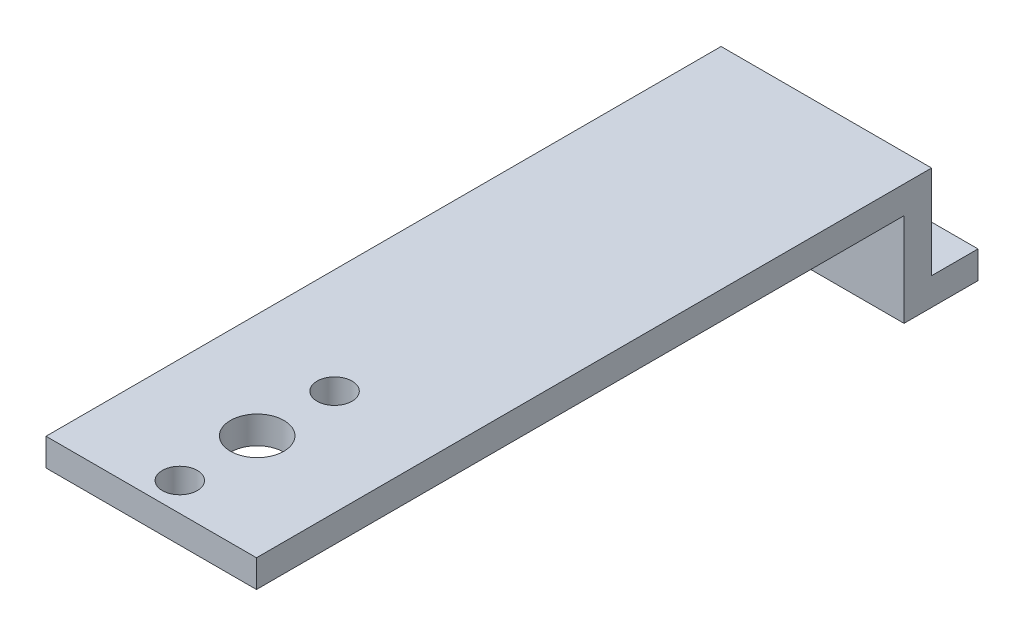
ISO-10303-21;
HEADER;
FILE_DESCRIPTION(('STEP AP214'),'2;1');
FILE_NAME('part.step','',(''),(''),'','','');
FILE_SCHEMA(('AUTOMOTIVE_DESIGN { 1 0 10303 214 1 1 1 1 }'));
ENDSEC;
DATA;
#1=APPLICATION_CONTEXT('core data for automotive mechanical design processes');
#2=APPLICATION_PROTOCOL_DEFINITION('international standard','automotive_design',2000,#1);
#3=PRODUCT_CONTEXT('',#1,'mechanical');
#4=PRODUCT('Part','Part','',(#3));
#5=PRODUCT_RELATED_PRODUCT_CATEGORY('part','',(#4));
#6=PRODUCT_DEFINITION_FORMATION('','',#4);
#7=PRODUCT_DEFINITION_CONTEXT('part definition',#1,'design');
#8=PRODUCT_DEFINITION('design','',#6,#7);
#9=PRODUCT_DEFINITION_SHAPE('','',#8);
#10=(LENGTH_UNIT() NAMED_UNIT(*) SI_UNIT(.MILLI.,.METRE.));
#11=(NAMED_UNIT(*) PLANE_ANGLE_UNIT() SI_UNIT($,.RADIAN.));
#12=(NAMED_UNIT(*) SI_UNIT($,.STERADIAN.) SOLID_ANGLE_UNIT());
#13=UNCERTAINTY_MEASURE_WITH_UNIT(LENGTH_MEASURE(1.E-05),#10,'distance_accuracy_value','');
#14=(GEOMETRIC_REPRESENTATION_CONTEXT(3) GLOBAL_UNCERTAINTY_ASSIGNED_CONTEXT((#13)) GLOBAL_UNIT_ASSIGNED_CONTEXT((#10,
#11,#12)) REPRESENTATION_CONTEXT('',''));
#15=CARTESIAN_POINT('',(0.,0.,0.));
#16=DIRECTION('',(0.,0.,1.));
#17=DIRECTION('',(1.,0.,0.));
#18=AXIS2_PLACEMENT_3D('',#15,#16,#17);
#19=CARTESIAN_POINT('',(-6.8,-3.90300000000001,0.888999999999991));
#20=DIRECTION('',(0.,-1.,0.));
#21=DIRECTION('',(0.,0.,-1.));
#22=AXIS2_PLACEMENT_3D('',#19,#20,#21);
#23=PLANE('',#22);
#24=DIRECTION('',(1.,0.,0.));
#25=VECTOR('',#24,1.);
#26=CARTESIAN_POINT('',(-6.8,-3.90300000000001,-3.88900000000001));
#27=LINE('',#26,#25);
#28=CARTESIAN_POINT('',(-6.8,-3.90300000000001,-3.88900000000001));
#29=VERTEX_POINT('',#28);
#30=CARTESIAN_POINT('',(6.8,-3.90300000000001,-3.88900000000001));
#31=VERTEX_POINT('',#30);
#32=EDGE_CURVE('E36',#29,#31,#27,.T.);
#33=ORIENTED_EDGE('',*,*,#32,.T.);
#34=DIRECTION('',(0.,0.,-1.));
#35=VECTOR('',#34,1.);
#36=CARTESIAN_POINT('',(6.8,-3.90300000000001,0.888999999999991));
#37=LINE('',#36,#35);
#38=CARTESIAN_POINT('',(6.8,-3.90300000000001,0.888999999999991));
#39=VERTEX_POINT('',#38);
#40=EDGE_CURVE('E97',#39,#31,#37,.T.);
#41=ORIENTED_EDGE('',*,*,#40,.F.);
#42=DIRECTION('',(1.,0.,0.));
#43=VECTOR('',#42,1.);
#44=CARTESIAN_POINT('',(-6.8,-3.90300000000001,0.888999999999991));
#45=LINE('',#44,#43);
#46=CARTESIAN_POINT('',(-6.8,-3.90300000000001,0.888999999999991));
#47=VERTEX_POINT('',#46);
#48=EDGE_CURVE('E11',#47,#39,#45,.T.);
#49=ORIENTED_EDGE('',*,*,#48,.F.);
#50=DIRECTION('',(0.,0.,-1.));
#51=VECTOR('',#50,1.);
#52=CARTESIAN_POINT('',(-6.8,-3.90300000000001,0.888999999999991));
#53=LINE('',#52,#51);
#54=EDGE_CURVE('E98',#47,#29,#53,.T.);
#55=ORIENTED_EDGE('',*,*,#54,.T.);
#56=EDGE_LOOP('',(#33,#41,#49,#55));
#57=FACE_BOUND('',#56,.T.);
#58=ADVANCED_FACE('F33',(#57),#23,.T.);
#59=CARTESIAN_POINT('',(-6.8,2.12499999999999,0.888999999999992));
#60=DIRECTION('',(0.,0.,1.));
#61=DIRECTION('',(0.,-1.,0.));
#62=AXIS2_PLACEMENT_3D('',#59,#60,#61);
#63=PLANE('',#62);
#64=ORIENTED_EDGE('',*,*,#48,.T.);
#65=DIRECTION('',(0.,-1.,0.));
#66=VECTOR('',#65,1.);
#67=CARTESIAN_POINT('',(6.8,2.12499999999999,0.888999999999992));
#68=LINE('',#67,#66);
#69=CARTESIAN_POINT('',(6.8,2.12499999999999,0.888999999999992));
#70=VERTEX_POINT('',#69);
#71=EDGE_CURVE('E115',#70,#39,#68,.T.);
#72=ORIENTED_EDGE('',*,*,#71,.F.);
#73=DIRECTION('',(1.,0.,0.));
#74=VECTOR('',#73,1.);
#75=CARTESIAN_POINT('',(-6.8,2.12499999999999,0.888999999999992));
#76=LINE('',#75,#74);
#77=CARTESIAN_POINT('',(-6.8,2.12499999999999,0.888999999999992));
#78=VERTEX_POINT('',#77);
#79=EDGE_CURVE('E41',#78,#70,#76,.T.);
#80=ORIENTED_EDGE('',*,*,#79,.F.);
#81=DIRECTION('',(0.,-1.,0.));
#82=VECTOR('',#81,1.);
#83=CARTESIAN_POINT('',(-6.8,2.12499999999999,0.888999999999992));
#84=LINE('',#83,#82);
#85=EDGE_CURVE('E103',#78,#47,#84,.T.);
#86=ORIENTED_EDGE('',*,*,#85,.T.);
#87=EDGE_LOOP('',(#64,#72,#80,#86));
#88=FACE_BOUND('',#87,.T.);
#89=ADVANCED_FACE('F184',(#88),#63,.T.);
#90=CARTESIAN_POINT('',(-6.8,2.12499999999999,0.888999999999992));
#91=DIRECTION('',(0.,-1.,0.));
#92=DIRECTION('',(0.,0.,-1.));
#93=AXIS2_PLACEMENT_3D('',#90,#91,#92);
#94=PLANE('',#93);
#95=CARTESIAN_POINT('',(0.,2.12499999999999,30.8857));
#96=DIRECTION('',(0.,-1.,0.));
#97=DIRECTION('',(0.,0.,-1.));
#98=AXIS2_PLACEMENT_3D('',#95,#96,#97);
#99=CIRCLE('',#98,1.1303);
#100=CARTESIAN_POINT('',(0.,2.12499999999999,32.016));
#101=VERTEX_POINT('',#100);
#102=EDGE_CURVE('E230',#101,#101,#99,.F.);
#103=ORIENTED_EDGE('',*,*,#102,.T.);
#104=EDGE_LOOP('',(#103));
#105=FACE_BOUND('',#104,.T.);
#106=CARTESIAN_POINT('',(0.,2.12499999999999,35.8857));
#107=DIRECTION('',(0.,-1.,0.));
#108=DIRECTION('',(0.,0.,-1.));
#109=AXIS2_PLACEMENT_3D('',#106,#107,#108);
#110=CIRCLE('',#109,1.7272);
#111=CARTESIAN_POINT('',(0.,2.12499999999999,37.6129));
#112=VERTEX_POINT('',#111);
#113=EDGE_CURVE('E234',#112,#112,#110,.F.);
#114=ORIENTED_EDGE('',*,*,#113,.T.);
#115=EDGE_LOOP('',(#114));
#116=FACE_BOUND('',#115,.T.);
#117=CARTESIAN_POINT('',(0.,2.12499999999999,40.8857));
#118=DIRECTION('',(0.,-1.,0.));
#119=DIRECTION('',(0.,0.,-1.));
#120=AXIS2_PLACEMENT_3D('',#117,#118,#119);
#121=CIRCLE('',#120,1.1303);
#122=CARTESIAN_POINT('',(0.,2.12499999999999,42.016));
#123=VERTEX_POINT('',#122);
#124=EDGE_CURVE('E119',#123,#123,#121,.F.);
#125=ORIENTED_EDGE('',*,*,#124,.T.);
#126=EDGE_LOOP('',(#125));
#127=FACE_BOUND('',#126,.T.);
#128=ORIENTED_EDGE('',*,*,#79,.T.);
#129=DIRECTION('',(0.,0.,-1.));
#130=VECTOR('',#129,1.);
#131=CARTESIAN_POINT('',(6.8,2.12499999999999,0.888999999999992));
#132=LINE('',#131,#130);
#133=CARTESIAN_POINT('',(6.8,2.12499999999999,42.731));
#134=VERTEX_POINT('',#133);
#135=EDGE_CURVE('E133',#134,#70,#132,.T.);
#136=ORIENTED_EDGE('',*,*,#135,.F.);
#137=DIRECTION('',(1.,0.,0.));
#138=VECTOR('',#137,1.);
#139=CARTESIAN_POINT('',(-6.8,2.12499999999999,42.731));
#140=LINE('',#139,#138);
#141=CARTESIAN_POINT('',(-6.8,2.12499999999999,42.731));
#142=VERTEX_POINT('',#141);
#143=EDGE_CURVE('E154',#142,#134,#140,.T.);
#144=ORIENTED_EDGE('',*,*,#143,.F.);
#145=DIRECTION('',(0.,0.,-1.));
#146=VECTOR('',#145,1.);
#147=CARTESIAN_POINT('',(-6.8,2.12499999999999,0.888999999999992));
#148=LINE('',#147,#146);
#149=EDGE_CURVE('E150',#142,#78,#148,.T.);
#150=ORIENTED_EDGE('',*,*,#149,.T.);
#151=EDGE_LOOP('',(#128,#136,#144,#150));
#152=FACE_BOUND('',#151,.T.);
#153=ADVANCED_FACE('F183',(#105,#116,#127,#152),#94,.T.);
#154=CARTESIAN_POINT('',(-6.8,3.90299999999999,42.731));
#155=DIRECTION('',(0.,0.,1.));
#156=DIRECTION('',(1.,0.,0.));
#157=AXIS2_PLACEMENT_3D('',#154,#155,#156);
#158=PLANE('',#157);
#159=ORIENTED_EDGE('',*,*,#143,.T.);
#160=DIRECTION('',(0.,-1.,0.));
#161=VECTOR('',#160,1.);
#162=CARTESIAN_POINT('',(6.8,3.90299999999999,42.731));
#163=LINE('',#162,#161);
#164=CARTESIAN_POINT('',(6.8,3.90299999999999,42.731));
#165=VERTEX_POINT('',#164);
#166=EDGE_CURVE('E130',#165,#134,#163,.T.);
#167=ORIENTED_EDGE('',*,*,#166,.F.);
#168=DIRECTION('',(1.,0.,0.));
#169=VECTOR('',#168,1.);
#170=CARTESIAN_POINT('',(-6.8,3.90299999999999,42.731));
#171=LINE('',#170,#169);
#172=CARTESIAN_POINT('',(-6.8,3.90299999999999,42.731));
#173=VERTEX_POINT('',#172);
#174=EDGE_CURVE('E156',#173,#165,#171,.T.);
#175=ORIENTED_EDGE('',*,*,#174,.F.);
#176=DIRECTION('',(0.,-1.,0.));
#177=VECTOR('',#176,1.);
#178=CARTESIAN_POINT('',(-6.8,3.90299999999999,42.731));
#179=LINE('',#178,#177);
#180=EDGE_CURVE('E147',#173,#142,#179,.T.);
#181=ORIENTED_EDGE('',*,*,#180,.T.);
#182=EDGE_LOOP('',(#159,#167,#175,#181));
#183=FACE_BOUND('',#182,.T.);
#184=ADVANCED_FACE('F179',(#183),#158,.T.);
#185=CARTESIAN_POINT('',(-6.8,3.903,0.888999999999999));
#186=DIRECTION('',(0.,1.,0.));
#187=DIRECTION('',(0.,0.,1.));
#188=AXIS2_PLACEMENT_3D('',#185,#186,#187);
#189=PLANE('',#188);
#190=CARTESIAN_POINT('',(0.,3.90299999999999,30.8857));
#191=DIRECTION('',(0.,1.,0.));
#192=DIRECTION('',(0.,0.,1.));
#193=AXIS2_PLACEMENT_3D('',#190,#191,#192);
#194=CIRCLE('',#193,1.1303);
#195=CARTESIAN_POINT('',(0.,3.90299999999999,32.016));
#196=VERTEX_POINT('',#195);
#197=EDGE_CURVE('E233',#196,#196,#194,.T.);
#198=ORIENTED_EDGE('',*,*,#197,.F.);
#199=EDGE_LOOP('',(#198));
#200=FACE_BOUND('',#199,.T.);
#201=CARTESIAN_POINT('',(0.,3.90299999999999,35.8857));
#202=DIRECTION('',(0.,1.,0.));
#203=DIRECTION('',(0.,0.,1.));
#204=AXIS2_PLACEMENT_3D('',#201,#202,#203);
#205=CIRCLE('',#204,1.7272);
#206=CARTESIAN_POINT('',(0.,3.90299999999999,37.6129));
#207=VERTEX_POINT('',#206);
#208=EDGE_CURVE('E237',#207,#207,#205,.T.);
#209=ORIENTED_EDGE('',*,*,#208,.F.);
#210=EDGE_LOOP('',(#209));
#211=FACE_BOUND('',#210,.T.);
#212=CARTESIAN_POINT('',(0.,3.90299999999999,40.8857));
#213=DIRECTION('',(0.,1.,0.));
#214=DIRECTION('',(0.,0.,1.));
#215=AXIS2_PLACEMENT_3D('',#212,#213,#214);
#216=CIRCLE('',#215,1.1303);
#217=CARTESIAN_POINT('',(0.,3.90299999999999,42.016));
#218=VERTEX_POINT('',#217);
#219=EDGE_CURVE('E116',#218,#218,#216,.T.);
#220=ORIENTED_EDGE('',*,*,#219,.F.);
#221=EDGE_LOOP('',(#220));
#222=FACE_BOUND('',#221,.T.);
#223=ORIENTED_EDGE('',*,*,#174,.T.);
#224=DIRECTION('',(0.,0.,1.));
#225=VECTOR('',#224,1.);
#226=CARTESIAN_POINT('',(6.8,3.903,-0.889000000000001));
#227=LINE('',#226,#225);
#228=CARTESIAN_POINT('',(6.8,3.903,-0.889000000000001));
#229=VERTEX_POINT('',#228);
#230=EDGE_CURVE('E127',#229,#165,#227,.T.);
#231=ORIENTED_EDGE('',*,*,#230,.F.);
#232=DIRECTION('',(1.,0.,0.));
#233=VECTOR('',#232,1.);
#234=CARTESIAN_POINT('',(-6.8,3.903,-0.889000000000001));
#235=LINE('',#234,#233);
#236=CARTESIAN_POINT('',(-6.8,3.903,-0.889000000000001));
#237=VERTEX_POINT('',#236);
#238=EDGE_CURVE('E158',#237,#229,#235,.T.);
#239=ORIENTED_EDGE('',*,*,#238,.F.);
#240=DIRECTION('',(0.,0.,1.));
#241=VECTOR('',#240,1.);
#242=CARTESIAN_POINT('',(-6.8,3.903,-0.889000000000001));
#243=LINE('',#242,#241);
#244=EDGE_CURVE('E145',#237,#173,#243,.T.);
#245=ORIENTED_EDGE('',*,*,#244,.T.);
#246=EDGE_LOOP('',(#223,#231,#239,#245));
#247=FACE_BOUND('',#246,.T.);
#248=ADVANCED_FACE('F171',(#200,#211,#222,#247),#189,.T.);
#249=CARTESIAN_POINT('',(-6.8,3.903,-0.889000000000001));
#250=DIRECTION('',(0.,0.,-1.));
#251=DIRECTION('',(0.,1.,0.));
#252=AXIS2_PLACEMENT_3D('',#249,#250,#251);
#253=PLANE('',#252);
#254=ORIENTED_EDGE('',*,*,#238,.T.);
#255=DIRECTION('',(0.,1.,0.));
#256=VECTOR('',#255,1.);
#257=CARTESIAN_POINT('',(6.8,3.903,-0.889000000000001));
#258=LINE('',#257,#256);
#259=CARTESIAN_POINT('',(6.8,-2.125,-0.888999999999999));
#260=VERTEX_POINT('',#259);
#261=EDGE_CURVE('E124',#260,#229,#258,.T.);
#262=ORIENTED_EDGE('',*,*,#261,.F.);
#263=DIRECTION('',(1.,0.,0.));
#264=VECTOR('',#263,1.);
#265=CARTESIAN_POINT('',(-6.8,-2.125,-0.888999999999999));
#266=LINE('',#265,#264);
#267=CARTESIAN_POINT('',(-6.8,-2.125,-0.888999999999999));
#268=VERTEX_POINT('',#267);
#269=EDGE_CURVE('E160',#268,#260,#266,.T.);
#270=ORIENTED_EDGE('',*,*,#269,.F.);
#271=DIRECTION('',(0.,1.,0.));
#272=VECTOR('',#271,1.);
#273=CARTESIAN_POINT('',(-6.8,3.903,-0.889000000000001));
#274=LINE('',#273,#272);
#275=EDGE_CURVE('E142',#268,#237,#274,.T.);
#276=ORIENTED_EDGE('',*,*,#275,.T.);
#277=EDGE_LOOP('',(#254,#262,#270,#276));
#278=FACE_BOUND('',#277,.T.);
#279=ADVANCED_FACE('F168',(#278),#253,.T.);
#280=CARTESIAN_POINT('',(-6.8,-2.125,-0.888999999999999));
#281=DIRECTION('',(0.,1.,0.));
#282=DIRECTION('',(0.,0.,1.));
#283=AXIS2_PLACEMENT_3D('',#280,#281,#282);
#284=PLANE('',#283);
#285=ORIENTED_EDGE('',*,*,#269,.T.);
#286=DIRECTION('',(0.,0.,1.));
#287=VECTOR('',#286,1.);
#288=CARTESIAN_POINT('',(6.8,-2.125,-0.888999999999999));
#289=LINE('',#288,#287);
#290=CARTESIAN_POINT('',(6.8,-2.12500000000001,-3.88900000000001));
#291=VERTEX_POINT('',#290);
#292=EDGE_CURVE('E110',#291,#260,#289,.T.);
#293=ORIENTED_EDGE('',*,*,#292,.F.);
#294=DIRECTION('',(1.,0.,0.));
#295=VECTOR('',#294,1.);
#296=CARTESIAN_POINT('',(-6.8,-2.12500000000001,-3.88900000000001));
#297=LINE('',#296,#295);
#298=CARTESIAN_POINT('',(-6.8,-2.12500000000001,-3.88900000000001));
#299=VERTEX_POINT('',#298);
#300=EDGE_CURVE('E102',#299,#291,#297,.T.);
#301=ORIENTED_EDGE('',*,*,#300,.F.);
#302=DIRECTION('',(0.,0.,1.));
#303=VECTOR('',#302,1.);
#304=CARTESIAN_POINT('',(-6.8,-2.125,-0.888999999999999));
#305=LINE('',#304,#303);
#306=EDGE_CURVE('E139',#299,#268,#305,.T.);
#307=ORIENTED_EDGE('',*,*,#306,.T.);
#308=EDGE_LOOP('',(#285,#293,#301,#307));
#309=FACE_BOUND('',#308,.T.);
#310=ADVANCED_FACE('F162',(#309),#284,.T.);
#311=CARTESIAN_POINT('',(-6.8,-3.90300000000001,-3.88900000000001));
#312=DIRECTION('',(0.,0.,-1.));
#313=DIRECTION('',(-1.,0.,0.));
#314=AXIS2_PLACEMENT_3D('',#311,#312,#313);
#315=PLANE('',#314);
#316=ORIENTED_EDGE('',*,*,#300,.T.);
#317=DIRECTION('',(0.,1.,0.));
#318=VECTOR('',#317,1.);
#319=CARTESIAN_POINT('',(6.8,-3.90300000000001,-3.88900000000001));
#320=LINE('',#319,#318);
#321=EDGE_CURVE('E105',#31,#291,#320,.T.);
#322=ORIENTED_EDGE('',*,*,#321,.F.);
#323=ORIENTED_EDGE('',*,*,#32,.F.);
#324=DIRECTION('',(0.,1.,0.));
#325=VECTOR('',#324,1.);
#326=CARTESIAN_POINT('',(-6.8,-3.90300000000001,-3.88900000000001));
#327=LINE('',#326,#325);
#328=EDGE_CURVE('E137',#29,#299,#327,.T.);
#329=ORIENTED_EDGE('',*,*,#328,.T.);
#330=EDGE_LOOP('',(#316,#322,#323,#329));
#331=FACE_BOUND('',#330,.T.);
#332=ADVANCED_FACE('F106',(#331),#315,.T.);
#333=CARTESIAN_POINT('',(-6.8,0.,0.));
#334=DIRECTION('',(1.,0.,0.));
#335=DIRECTION('',(0.,0.,-1.));
#336=AXIS2_PLACEMENT_3D('',#333,#334,#335);
#337=PLANE('',#336);
#338=ORIENTED_EDGE('',*,*,#54,.F.);
#339=ORIENTED_EDGE('',*,*,#85,.F.);
#340=ORIENTED_EDGE('',*,*,#149,.F.);
#341=ORIENTED_EDGE('',*,*,#180,.F.);
#342=ORIENTED_EDGE('',*,*,#244,.F.);
#343=ORIENTED_EDGE('',*,*,#275,.F.);
#344=ORIENTED_EDGE('',*,*,#306,.F.);
#345=ORIENTED_EDGE('',*,*,#328,.F.);
#346=EDGE_LOOP('',(#338,#339,#340,#341,#342,#343,#344,#345));
#347=FACE_BOUND('',#346,.T.);
#348=ADVANCED_FACE('F175',(#347),#337,.F.);
#349=CARTESIAN_POINT('',(6.8,0.,0.));
#350=DIRECTION('',(1.,0.,0.));
#351=DIRECTION('',(0.,0.,-1.));
#352=AXIS2_PLACEMENT_3D('',#349,#350,#351);
#353=PLANE('',#352);
#354=ORIENTED_EDGE('',*,*,#40,.T.);
#355=ORIENTED_EDGE('',*,*,#321,.T.);
#356=ORIENTED_EDGE('',*,*,#292,.T.);
#357=ORIENTED_EDGE('',*,*,#261,.T.);
#358=ORIENTED_EDGE('',*,*,#230,.T.);
#359=ORIENTED_EDGE('',*,*,#166,.T.);
#360=ORIENTED_EDGE('',*,*,#135,.T.);
#361=ORIENTED_EDGE('',*,*,#71,.T.);
#362=EDGE_LOOP('',(#354,#355,#356,#357,#358,#359,#360,#361));
#363=FACE_BOUND('',#362,.T.);
#364=ADVANCED_FACE('F113',(#363),#353,.T.);
#365=CARTESIAN_POINT('',(0.,-3.90400000000003,40.8857));
#366=DIRECTION('',(0.,1.,0.));
#367=DIRECTION('',(0.,0.,1.));
#368=AXIS2_PLACEMENT_3D('',#365,#366,#367);
#369=CYLINDRICAL_SURFACE('',#368,1.1303);
#370=CARTESIAN_POINT('',(0.,2.12499999999999,42.016));
#371=CARTESIAN_POINT('',(0.,2.14352083333332,42.016));
#372=CARTESIAN_POINT('',(0.,2.16204166666665,42.016));
#373=CARTESIAN_POINT('',(0.,2.19908333333332,42.016));
#374=CARTESIAN_POINT('',(0.,2.21760416666665,42.016));
#375=CARTESIAN_POINT('',(0.,2.25464583333332,42.016));
#376=CARTESIAN_POINT('',(0.,2.27316666666665,42.016));
#377=CARTESIAN_POINT('',(0.,2.31020833333332,42.016));
#378=CARTESIAN_POINT('',(0.,2.32872916666665,42.016));
#379=CARTESIAN_POINT('',(0.,2.36577083333332,42.016));
#380=CARTESIAN_POINT('',(0.,2.38429166666665,42.016));
#381=CARTESIAN_POINT('',(0.,2.42133333333332,42.016));
#382=CARTESIAN_POINT('',(0.,2.43985416666665,42.016));
#383=CARTESIAN_POINT('',(0.,2.47689583333332,42.016));
#384=CARTESIAN_POINT('',(0.,2.49541666666665,42.016));
#385=CARTESIAN_POINT('',(0.,2.53245833333332,42.016));
#386=CARTESIAN_POINT('',(0.,2.55097916666665,42.016));
#387=CARTESIAN_POINT('',(0.,2.58802083333332,42.016));
#388=CARTESIAN_POINT('',(0.,2.60654166666665,42.016));
#389=CARTESIAN_POINT('',(0.,2.64358333333332,42.016));
#390=CARTESIAN_POINT('',(0.,2.66210416666665,42.016));
#391=CARTESIAN_POINT('',(0.,2.69914583333332,42.016));
#392=CARTESIAN_POINT('',(0.,2.71766666666665,42.016));
#393=CARTESIAN_POINT('',(0.,2.75470833333332,42.016));
#394=CARTESIAN_POINT('',(0.,2.77322916666665,42.016));
#395=CARTESIAN_POINT('',(0.,2.81027083333332,42.016));
#396=CARTESIAN_POINT('',(0.,2.82879166666665,42.016));
#397=CARTESIAN_POINT('',(0.,2.86583333333332,42.016));
#398=CARTESIAN_POINT('',(0.,2.88435416666665,42.016));
#399=CARTESIAN_POINT('',(0.,2.92139583333332,42.016));
#400=CARTESIAN_POINT('',(0.,2.93991666666665,42.016));
#401=CARTESIAN_POINT('',(0.,2.97695833333332,42.016));
#402=CARTESIAN_POINT('',(0.,2.99547916666665,42.016));
#403=CARTESIAN_POINT('',(0.,3.03252083333332,42.016));
#404=CARTESIAN_POINT('',(0.,3.05104166666665,42.016));
#405=CARTESIAN_POINT('',(0.,3.08808333333332,42.016));
#406=CARTESIAN_POINT('',(0.,3.10660416666665,42.016));
#407=CARTESIAN_POINT('',(0.,3.14364583333332,42.016));
#408=CARTESIAN_POINT('',(0.,3.16216666666665,42.016));
#409=CARTESIAN_POINT('',(0.,3.19920833333332,42.016));
#410=CARTESIAN_POINT('',(0.,3.21772916666665,42.016));
#411=CARTESIAN_POINT('',(0.,3.25477083333332,42.016));
#412=CARTESIAN_POINT('',(0.,3.27329166666665,42.016));
#413=CARTESIAN_POINT('',(0.,3.31033333333332,42.016));
#414=CARTESIAN_POINT('',(0.,3.32885416666665,42.016));
#415=CARTESIAN_POINT('',(0.,3.36589583333332,42.016));
#416=CARTESIAN_POINT('',(0.,3.38441666666665,42.016));
#417=CARTESIAN_POINT('',(0.,3.42145833333332,42.016));
#418=CARTESIAN_POINT('',(0.,3.43997916666665,42.016));
#419=CARTESIAN_POINT('',(0.,3.47702083333332,42.016));
#420=CARTESIAN_POINT('',(0.,3.49554166666665,42.016));
#421=CARTESIAN_POINT('',(0.,3.53258333333332,42.016));
#422=CARTESIAN_POINT('',(0.,3.55110416666665,42.016));
#423=CARTESIAN_POINT('',(0.,3.58814583333332,42.016));
#424=CARTESIAN_POINT('',(0.,3.60666666666665,42.016));
#425=CARTESIAN_POINT('',(0.,3.64370833333332,42.016));
#426=CARTESIAN_POINT('',(0.,3.66222916666665,42.016));
#427=CARTESIAN_POINT('',(0.,3.69927083333332,42.016));
#428=CARTESIAN_POINT('',(0.,3.71779166666665,42.016));
#429=CARTESIAN_POINT('',(0.,3.75483333333332,42.016));
#430=CARTESIAN_POINT('',(0.,3.77335416666665,42.016));
#431=CARTESIAN_POINT('',(0.,3.81039583333332,42.016));
#432=CARTESIAN_POINT('',(0.,3.82891666666665,42.016));
#433=CARTESIAN_POINT('',(0.,3.86595833333332,42.016));
#434=CARTESIAN_POINT('',(0.,3.88447916666665,42.016));
#435=CARTESIAN_POINT('',(0.,3.90299999999999,42.016));
#436=B_SPLINE_CURVE_WITH_KNOTS('',3,(#370,#371,#372,#373,#374,#375,#376,#377,#378,#379,#380,
#381,#382,#383,#384,#385,#386,#387,#388,#389,#390,#391,#392,#393,#394,#395,#396,#397,#398,#399,
#400,#401,#402,#403,#404,#405,#406,#407,#408,#409,#410,#411,#412,#413,#414,#415,#416,#417,#418,
#419,#420,#421,#422,#423,#424,#425,#426,#427,#428,#429,#430,#431,#432,#433,#434,#435),
.UNSPECIFIED.,.F.,.F.,(4,2,2,2,2,2,2,2,2,2,2,2,2,2,2,2,2,2,2,2,2,2,2,2,2,2,2,2,2,2,2,2,4),(0.,
0.0555625000000001,0.111125,0.1666875,0.22225,0.2778125,0.333375,0.3889375,0.4445,
0.500062500000001,0.555625000000001,0.611187500000001,0.666750000000001,0.722312500000001,
0.777875000000001,0.833437500000001,0.889000000000001,0.944562500000001,1.000125,1.0556875,
1.11125,1.1668125,1.222375,1.2779375,1.3335,1.3890625,1.444625,1.5001875,1.55575,1.6113125,
1.666875,1.7224375,1.778),.UNSPECIFIED.);
#437=EDGE_CURVE('BSEAM211',#123,#218,#436,.T.);
#438=ORIENTED_EDGE('',*,*,#124,.F.);
#439=ORIENTED_EDGE('',*,*,#219,.T.);
#440=ORIENTED_EDGE('',*,*,#437,.T.);
#441=ORIENTED_EDGE('',*,*,#437,.F.);
#442=EDGE_LOOP('',(#438,#440,#439,#441));
#443=FACE_BOUND('',#442,.T.);
#444=ADVANCED_FACE('F211',(#443),#369,.F.);
#445=CARTESIAN_POINT('',(0.,-3.90400000000003,35.8857));
#446=DIRECTION('',(0.,1.,0.));
#447=DIRECTION('',(0.,0.,1.));
#448=AXIS2_PLACEMENT_3D('',#445,#446,#447);
#449=CYLINDRICAL_SURFACE('',#448,1.7272);
#450=CARTESIAN_POINT('',(0.,2.12499999999999,37.6129));
#451=CARTESIAN_POINT('',(0.,2.14352083333332,37.6129));
#452=CARTESIAN_POINT('',(0.,2.16204166666665,37.6129));
#453=CARTESIAN_POINT('',(0.,2.19908333333332,37.6129));
#454=CARTESIAN_POINT('',(0.,2.21760416666665,37.6129));
#455=CARTESIAN_POINT('',(0.,2.25464583333332,37.6129));
#456=CARTESIAN_POINT('',(0.,2.27316666666665,37.6129));
#457=CARTESIAN_POINT('',(0.,2.31020833333332,37.6129));
#458=CARTESIAN_POINT('',(0.,2.32872916666665,37.6129));
#459=CARTESIAN_POINT('',(0.,2.36577083333332,37.6129));
#460=CARTESIAN_POINT('',(0.,2.38429166666665,37.6129));
#461=CARTESIAN_POINT('',(0.,2.42133333333332,37.6129));
#462=CARTESIAN_POINT('',(0.,2.43985416666665,37.6129));
#463=CARTESIAN_POINT('',(0.,2.47689583333332,37.6129));
#464=CARTESIAN_POINT('',(0.,2.49541666666665,37.6129));
#465=CARTESIAN_POINT('',(0.,2.53245833333332,37.6129));
#466=CARTESIAN_POINT('',(0.,2.55097916666665,37.6129));
#467=CARTESIAN_POINT('',(0.,2.58802083333332,37.6129));
#468=CARTESIAN_POINT('',(0.,2.60654166666665,37.6129));
#469=CARTESIAN_POINT('',(0.,2.64358333333332,37.6129));
#470=CARTESIAN_POINT('',(0.,2.66210416666665,37.6129));
#471=CARTESIAN_POINT('',(0.,2.69914583333332,37.6129));
#472=CARTESIAN_POINT('',(0.,2.71766666666665,37.6129));
#473=CARTESIAN_POINT('',(0.,2.75470833333332,37.6129));
#474=CARTESIAN_POINT('',(0.,2.77322916666665,37.6129));
#475=CARTESIAN_POINT('',(0.,2.81027083333332,37.6129));
#476=CARTESIAN_POINT('',(0.,2.82879166666665,37.6129));
#477=CARTESIAN_POINT('',(0.,2.86583333333332,37.6129));
#478=CARTESIAN_POINT('',(0.,2.88435416666665,37.6129));
#479=CARTESIAN_POINT('',(0.,2.92139583333332,37.6129));
#480=CARTESIAN_POINT('',(0.,2.93991666666665,37.6129));
#481=CARTESIAN_POINT('',(0.,2.97695833333332,37.6129));
#482=CARTESIAN_POINT('',(0.,2.99547916666665,37.6129));
#483=CARTESIAN_POINT('',(0.,3.03252083333332,37.6129));
#484=CARTESIAN_POINT('',(0.,3.05104166666665,37.6129));
#485=CARTESIAN_POINT('',(0.,3.08808333333332,37.6129));
#486=CARTESIAN_POINT('',(0.,3.10660416666665,37.6129));
#487=CARTESIAN_POINT('',(0.,3.14364583333332,37.6129));
#488=CARTESIAN_POINT('',(0.,3.16216666666665,37.6129));
#489=CARTESIAN_POINT('',(0.,3.19920833333332,37.6129));
#490=CARTESIAN_POINT('',(0.,3.21772916666665,37.6129));
#491=CARTESIAN_POINT('',(0.,3.25477083333332,37.6129));
#492=CARTESIAN_POINT('',(0.,3.27329166666665,37.6129));
#493=CARTESIAN_POINT('',(0.,3.31033333333332,37.6129));
#494=CARTESIAN_POINT('',(0.,3.32885416666665,37.6129));
#495=CARTESIAN_POINT('',(0.,3.36589583333332,37.6129));
#496=CARTESIAN_POINT('',(0.,3.38441666666665,37.6129));
#497=CARTESIAN_POINT('',(0.,3.42145833333332,37.6129));
#498=CARTESIAN_POINT('',(0.,3.43997916666665,37.6129));
#499=CARTESIAN_POINT('',(0.,3.47702083333332,37.6129));
#500=CARTESIAN_POINT('',(0.,3.49554166666665,37.6129));
#501=CARTESIAN_POINT('',(0.,3.53258333333332,37.6129));
#502=CARTESIAN_POINT('',(0.,3.55110416666665,37.6129));
#503=CARTESIAN_POINT('',(0.,3.58814583333332,37.6129));
#504=CARTESIAN_POINT('',(0.,3.60666666666665,37.6129));
#505=CARTESIAN_POINT('',(0.,3.64370833333332,37.6129));
#506=CARTESIAN_POINT('',(0.,3.66222916666665,37.6129));
#507=CARTESIAN_POINT('',(0.,3.69927083333332,37.6129));
#508=CARTESIAN_POINT('',(0.,3.71779166666665,37.6129));
#509=CARTESIAN_POINT('',(0.,3.75483333333332,37.6129));
#510=CARTESIAN_POINT('',(0.,3.77335416666666,37.6129));
#511=CARTESIAN_POINT('',(0.,3.81039583333332,37.6129));
#512=CARTESIAN_POINT('',(0.,3.82891666666665,37.6129));
#513=CARTESIAN_POINT('',(0.,3.86595833333332,37.6129));
#514=CARTESIAN_POINT('',(0.,3.88447916666665,37.6129));
#515=CARTESIAN_POINT('',(0.,3.90299999999999,37.6129));
#516=B_SPLINE_CURVE_WITH_KNOTS('',3,(#450,#451,#452,#453,#454,#455,#456,#457,#458,#459,#460,
#461,#462,#463,#464,#465,#466,#467,#468,#469,#470,#471,#472,#473,#474,#475,#476,#477,#478,#479,
#480,#481,#482,#483,#484,#485,#486,#487,#488,#489,#490,#491,#492,#493,#494,#495,#496,#497,#498,
#499,#500,#501,#502,#503,#504,#505,#506,#507,#508,#509,#510,#511,#512,#513,#514,#515),
.UNSPECIFIED.,.F.,.F.,(4,2,2,2,2,2,2,2,2,2,2,2,2,2,2,2,2,2,2,2,2,2,2,2,2,2,2,2,2,2,2,2,4),(0.,
0.0555625000000001,0.111125,0.1666875,0.22225,0.2778125,0.333375,0.3889375,0.4445,
0.500062500000001,0.555625000000001,0.611187500000001,0.666750000000001,0.722312500000001,
0.777875000000001,0.833437500000001,0.889000000000001,0.944562500000001,1.000125,1.0556875,
1.11125,1.1668125,1.222375,1.2779375,1.3335,1.3890625,1.444625,1.5001875,1.55575,1.6113125,
1.666875,1.7224375,1.778),.UNSPECIFIED.);
#517=EDGE_CURVE('BSEAM215',#112,#207,#516,.T.);
#518=ORIENTED_EDGE('',*,*,#113,.F.);
#519=ORIENTED_EDGE('',*,*,#208,.T.);
#520=ORIENTED_EDGE('',*,*,#517,.T.);
#521=ORIENTED_EDGE('',*,*,#517,.F.);
#522=EDGE_LOOP('',(#518,#520,#519,#521));
#523=FACE_BOUND('',#522,.T.);
#524=ADVANCED_FACE('F215',(#523),#449,.F.);
#525=CARTESIAN_POINT('',(0.,-3.90400000000002,30.8857));
#526=DIRECTION('',(0.,1.,0.));
#527=DIRECTION('',(0.,0.,1.));
#528=AXIS2_PLACEMENT_3D('',#525,#526,#527);
#529=CYLINDRICAL_SURFACE('',#528,1.1303);
#530=CARTESIAN_POINT('',(0.,2.12499999999999,32.016));
#531=CARTESIAN_POINT('',(0.,2.14352083333332,32.016));
#532=CARTESIAN_POINT('',(0.,2.16204166666665,32.016));
#533=CARTESIAN_POINT('',(0.,2.19908333333332,32.016));
#534=CARTESIAN_POINT('',(0.,2.21760416666665,32.016));
#535=CARTESIAN_POINT('',(0.,2.25464583333332,32.016));
#536=CARTESIAN_POINT('',(0.,2.27316666666665,32.016));
#537=CARTESIAN_POINT('',(0.,2.31020833333332,32.016));
#538=CARTESIAN_POINT('',(0.,2.32872916666665,32.016));
#539=CARTESIAN_POINT('',(0.,2.36577083333332,32.016));
#540=CARTESIAN_POINT('',(0.,2.38429166666665,32.016));
#541=CARTESIAN_POINT('',(0.,2.42133333333332,32.016));
#542=CARTESIAN_POINT('',(0.,2.43985416666665,32.016));
#543=CARTESIAN_POINT('',(0.,2.47689583333332,32.016));
#544=CARTESIAN_POINT('',(0.,2.49541666666665,32.016));
#545=CARTESIAN_POINT('',(0.,2.53245833333332,32.016));
#546=CARTESIAN_POINT('',(0.,2.55097916666665,32.016));
#547=CARTESIAN_POINT('',(0.,2.58802083333332,32.016));
#548=CARTESIAN_POINT('',(0.,2.60654166666665,32.016));
#549=CARTESIAN_POINT('',(0.,2.64358333333332,32.016));
#550=CARTESIAN_POINT('',(0.,2.66210416666666,32.016));
#551=CARTESIAN_POINT('',(0.,2.69914583333332,32.016));
#552=CARTESIAN_POINT('',(0.,2.71766666666666,32.016));
#553=CARTESIAN_POINT('',(0.,2.75470833333332,32.016));
#554=CARTESIAN_POINT('',(0.,2.77322916666666,32.016));
#555=CARTESIAN_POINT('',(0.,2.81027083333332,32.016));
#556=CARTESIAN_POINT('',(0.,2.82879166666666,32.016));
#557=CARTESIAN_POINT('',(0.,2.86583333333332,32.016));
#558=CARTESIAN_POINT('',(0.,2.88435416666666,32.016));
#559=CARTESIAN_POINT('',(0.,2.92139583333332,32.016));
#560=CARTESIAN_POINT('',(0.,2.93991666666666,32.016));
#561=CARTESIAN_POINT('',(0.,2.97695833333332,32.016));
#562=CARTESIAN_POINT('',(0.,2.99547916666666,32.016));
#563=CARTESIAN_POINT('',(0.,3.03252083333332,32.016));
#564=CARTESIAN_POINT('',(0.,3.05104166666666,32.016));
#565=CARTESIAN_POINT('',(0.,3.08808333333332,32.016));
#566=CARTESIAN_POINT('',(0.,3.10660416666666,32.016));
#567=CARTESIAN_POINT('',(0.,3.14364583333332,32.016));
#568=CARTESIAN_POINT('',(0.,3.16216666666666,32.016));
#569=CARTESIAN_POINT('',(0.,3.19920833333332,32.016));
#570=CARTESIAN_POINT('',(0.,3.21772916666666,32.016));
#571=CARTESIAN_POINT('',(0.,3.25477083333332,32.016));
#572=CARTESIAN_POINT('',(0.,3.27329166666666,32.016));
#573=CARTESIAN_POINT('',(0.,3.31033333333332,32.016));
#574=CARTESIAN_POINT('',(0.,3.32885416666666,32.016));
#575=CARTESIAN_POINT('',(0.,3.36589583333332,32.016));
#576=CARTESIAN_POINT('',(0.,3.38441666666666,32.016));
#577=CARTESIAN_POINT('',(0.,3.42145833333332,32.016));
#578=CARTESIAN_POINT('',(0.,3.43997916666666,32.016));
#579=CARTESIAN_POINT('',(0.,3.47702083333332,32.016));
#580=CARTESIAN_POINT('',(0.,3.49554166666666,32.016));
#581=CARTESIAN_POINT('',(0.,3.53258333333332,32.016));
#582=CARTESIAN_POINT('',(0.,3.55110416666666,32.016));
#583=CARTESIAN_POINT('',(0.,3.58814583333332,32.016));
#584=CARTESIAN_POINT('',(0.,3.60666666666666,32.016));
#585=CARTESIAN_POINT('',(0.,3.64370833333332,32.016));
#586=CARTESIAN_POINT('',(0.,3.66222916666666,32.016));
#587=CARTESIAN_POINT('',(0.,3.69927083333332,32.016));
#588=CARTESIAN_POINT('',(0.,3.71779166666666,32.016));
#589=CARTESIAN_POINT('',(0.,3.75483333333332,32.016));
#590=CARTESIAN_POINT('',(0.,3.77335416666666,32.016));
#591=CARTESIAN_POINT('',(0.,3.81039583333332,32.016));
#592=CARTESIAN_POINT('',(0.,3.82891666666666,32.016));
#593=CARTESIAN_POINT('',(0.,3.86595833333332,32.016));
#594=CARTESIAN_POINT('',(0.,3.88447916666666,32.016));
#595=CARTESIAN_POINT('',(0.,3.90299999999999,32.016));
#596=B_SPLINE_CURVE_WITH_KNOTS('',3,(#530,#531,#532,#533,#534,#535,#536,#537,#538,#539,#540,
#541,#542,#543,#544,#545,#546,#547,#548,#549,#550,#551,#552,#553,#554,#555,#556,#557,#558,#559,
#560,#561,#562,#563,#564,#565,#566,#567,#568,#569,#570,#571,#572,#573,#574,#575,#576,#577,#578,
#579,#580,#581,#582,#583,#584,#585,#586,#587,#588,#589,#590,#591,#592,#593,#594,#595),
.UNSPECIFIED.,.F.,.F.,(4,2,2,2,2,2,2,2,2,2,2,2,2,2,2,2,2,2,2,2,2,2,2,2,2,2,2,2,2,2,2,2,4),(0.,
0.0555625000000001,0.111125,0.1666875,0.22225,0.2778125,0.333375,0.3889375,0.4445,
0.500062500000001,0.555625000000001,0.611187500000001,0.666750000000002,0.722312500000002,
0.777875000000002,0.833437500000002,0.889000000000002,0.944562500000002,1.000125,1.0556875,
1.11125,1.1668125,1.222375,1.2779375,1.3335,1.3890625,1.444625,1.5001875,1.55575,1.6113125,
1.666875,1.7224375,1.778),.UNSPECIFIED.);
#597=EDGE_CURVE('BSEAM221',#101,#196,#596,.T.);
#598=ORIENTED_EDGE('',*,*,#102,.F.);
#599=ORIENTED_EDGE('',*,*,#197,.T.);
#600=ORIENTED_EDGE('',*,*,#597,.T.);
#601=ORIENTED_EDGE('',*,*,#597,.F.);
#602=EDGE_LOOP('',(#598,#600,#599,#601));
#603=FACE_BOUND('',#602,.T.);
#604=ADVANCED_FACE('F221',(#603),#529,.F.);
#605=CLOSED_SHELL('',(#58,#89,#153,#184,#248,#279,#310,#332,#348,#364,#444,#524,#604));
#606=MANIFOLD_SOLID_BREP('B2',#605);
#607=ADVANCED_BREP_SHAPE_REPRESENTATION('',(#18,#606),#14);
#608=SHAPE_DEFINITION_REPRESENTATION(#9,#607);
ENDSEC;
END-ISO-10303-21;
